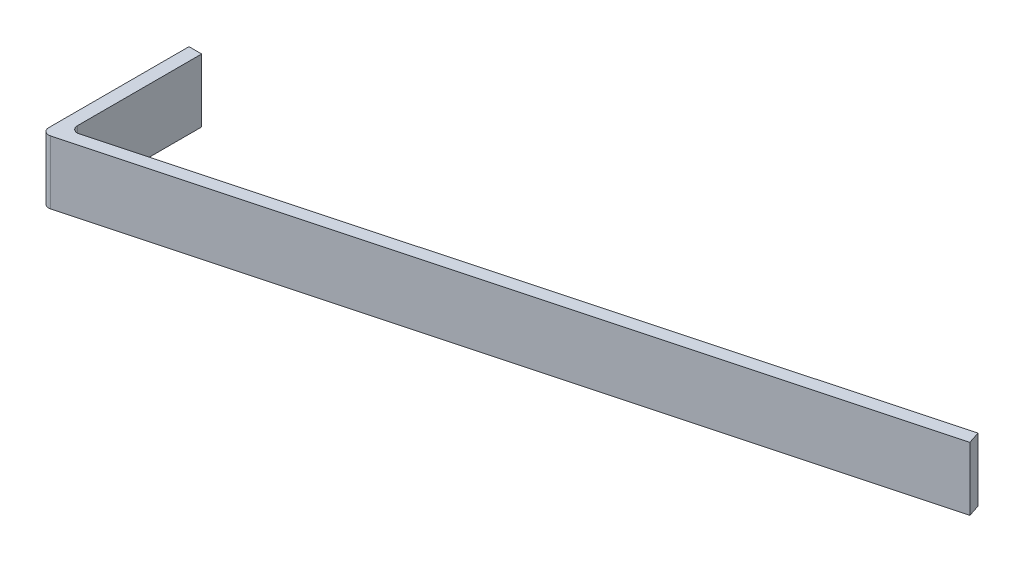
ISO-10303-21;
HEADER;
FILE_DESCRIPTION(('STEP AP214'),'2;1');
FILE_NAME('part.step','',(''),(''),'','','');
FILE_SCHEMA(('AUTOMOTIVE_DESIGN { 1 0 10303 214 1 1 1 1 }'));
ENDSEC;
DATA;
#1=APPLICATION_CONTEXT('core data for automotive mechanical design processes');
#2=APPLICATION_PROTOCOL_DEFINITION('international standard','automotive_design',2000,#1);
#3=PRODUCT_CONTEXT('',#1,'mechanical');
#4=PRODUCT('Part','Part','',(#3));
#5=PRODUCT_RELATED_PRODUCT_CATEGORY('part','',(#4));
#6=PRODUCT_DEFINITION_FORMATION('','',#4);
#7=PRODUCT_DEFINITION_CONTEXT('part definition',#1,'design');
#8=PRODUCT_DEFINITION('design','',#6,#7);
#9=PRODUCT_DEFINITION_SHAPE('','',#8);
#10=(LENGTH_UNIT() NAMED_UNIT(*) SI_UNIT(.MILLI.,.METRE.));
#11=(NAMED_UNIT(*) PLANE_ANGLE_UNIT() SI_UNIT($,.RADIAN.));
#12=(NAMED_UNIT(*) SI_UNIT($,.STERADIAN.) SOLID_ANGLE_UNIT());
#13=UNCERTAINTY_MEASURE_WITH_UNIT(LENGTH_MEASURE(1.E-05),#10,'distance_accuracy_value','');
#14=(GEOMETRIC_REPRESENTATION_CONTEXT(3) GLOBAL_UNCERTAINTY_ASSIGNED_CONTEXT((#13)) GLOBAL_UNIT_ASSIGNED_CONTEXT((#10,
#11,#12)) REPRESENTATION_CONTEXT('',''));
#15=CARTESIAN_POINT('',(0.,0.,0.));
#16=DIRECTION('',(0.,0.,1.));
#17=DIRECTION('',(1.,0.,0.));
#18=AXIS2_PLACEMENT_3D('',#15,#16,#17);
#19=CARTESIAN_POINT('',(0.,10.,0.));
#20=DIRECTION('',(1.,0.,0.));
#21=DIRECTION('',(0.,0.,-1.));
#22=AXIS2_PLACEMENT_3D('',#19,#20,#21);
#23=PLANE('',#22);
#24=DIRECTION('',(0.,0.,1.));
#25=VECTOR('',#24,1.);
#26=CARTESIAN_POINT('',(0.,0.,0.));
#27=LINE('',#26,#25);
#28=CARTESIAN_POINT('',(0.,0.,-23.5));
#29=VERTEX_POINT('',#28);
#30=CARTESIAN_POINT('',(0.,0.,-1.3032253728412));
#31=VERTEX_POINT('',#30);
#32=EDGE_CURVE('E123',#29,#31,#27,.T.);
#33=ORIENTED_EDGE('',*,*,#32,.T.);
#34=DIRECTION('',(0.,-1.,0.));
#35=VECTOR('',#34,1.);
#36=CARTESIAN_POINT('',(0.,10.,-1.3032253728412));
#37=LINE('',#36,#35);
#38=CARTESIAN_POINT('',(0.,10.,-1.3032253728412));
#39=VERTEX_POINT('',#38);
#40=EDGE_CURVE('E151',#31,#39,#37,.F.);
#41=ORIENTED_EDGE('',*,*,#40,.T.);
#42=DIRECTION('',(0.,0.,1.));
#43=VECTOR('',#42,1.);
#44=CARTESIAN_POINT('',(0.,10.,0.));
#45=LINE('',#44,#43);
#46=CARTESIAN_POINT('',(0.,10.,-23.5));
#47=VERTEX_POINT('',#46);
#48=EDGE_CURVE('E125',#47,#39,#45,.T.);
#49=ORIENTED_EDGE('',*,*,#48,.F.);
#50=DIRECTION('',(0.,-1.,0.));
#51=VECTOR('',#50,1.);
#52=CARTESIAN_POINT('',(0.,10.,-23.5));
#53=LINE('',#52,#51);
#54=EDGE_CURVE('E133',#47,#29,#53,.T.);
#55=ORIENTED_EDGE('',*,*,#54,.T.);
#56=EDGE_LOOP('',(#33,#41,#49,#55));
#57=FACE_BOUND('',#56,.T.);
#58=ADVANCED_FACE('F35',(#57),#23,.F.);
#59=CARTESIAN_POINT('',(0.,10.,0.));
#60=DIRECTION('',(-0.258819045102518,0.,-0.965925826289069));
#61=DIRECTION('',(-0.965925826289069,0.,0.258819045102518));
#62=AXIS2_PLACEMENT_3D('',#59,#60,#61);
#63=PLANE('',#62);
#64=DIRECTION('',(0.965925826289069,0.,-0.258819045102518));
#65=VECTOR('',#64,1.);
#66=CARTESIAN_POINT('',(0.,10.,0.));
#67=LINE('',#66,#65);
#68=CARTESIAN_POINT('',(1.25881904510252,10.,-0.337299546552133));
#69=VERTEX_POINT('',#68);
#70=CARTESIAN_POINT('',(115.911099154688,10.,-31.0582854123021));
#71=VERTEX_POINT('',#70);
#72=EDGE_CURVE('E116',#69,#71,#67,.T.);
#73=ORIENTED_EDGE('',*,*,#72,.F.);
#74=DIRECTION('',(0.,-1.,0.));
#75=VECTOR('',#74,1.);
#76=CARTESIAN_POINT('',(1.25881904510252,10.,-0.337299546552133));
#77=LINE('',#76,#75);
#78=CARTESIAN_POINT('',(1.25881904510252,0.,-0.337299546552133));
#79=VERTEX_POINT('',#78);
#80=EDGE_CURVE('E146',#69,#79,#77,.T.);
#81=ORIENTED_EDGE('',*,*,#80,.T.);
#82=DIRECTION('',(0.965925826289069,0.,-0.258819045102518));
#83=VECTOR('',#82,1.);
#84=CARTESIAN_POINT('',(0.,0.,0.));
#85=LINE('',#84,#83);
#86=CARTESIAN_POINT('',(115.911099154688,0.,-31.0582854123021));
#87=VERTEX_POINT('',#86);
#88=EDGE_CURVE('E136',#79,#87,#85,.T.);
#89=ORIENTED_EDGE('',*,*,#88,.T.);
#90=DIRECTION('',(0.,-1.,0.));
#91=VECTOR('',#90,1.);
#92=CARTESIAN_POINT('',(115.911099154688,10.,-31.0582854123021));
#93=LINE('',#92,#91);
#94=EDGE_CURVE('E111',#71,#87,#93,.T.);
#95=ORIENTED_EDGE('',*,*,#94,.F.);
#96=EDGE_LOOP('',(#73,#81,#89,#95));
#97=FACE_BOUND('',#96,.T.);
#98=ADVANCED_FACE('F181',(#97),#63,.F.);
#99=CARTESIAN_POINT('',(2.,10.,-0.535898384862239));
#100=DIRECTION('',(-1.,0.,0.));
#101=DIRECTION('',(0.,0.,1.));
#102=AXIS2_PLACEMENT_3D('',#99,#100,#101);
#103=PLANE('',#102);
#104=DIRECTION('',(0.,0.,-1.));
#105=VECTOR('',#104,1.);
#106=CARTESIAN_POINT('',(2.,10.,-0.535898384862239));
#107=LINE('',#106,#105);
#108=CARTESIAN_POINT('',(2.,10.,-3.84102587555032));
#109=VERTEX_POINT('',#108);
#110=CARTESIAN_POINT('',(2.,10.,-23.5));
#111=VERTEX_POINT('',#110);
#112=EDGE_CURVE('E129',#109,#111,#107,.T.);
#113=ORIENTED_EDGE('',*,*,#112,.F.);
#114=DIRECTION('',(0.,-1.,0.));
#115=VECTOR('',#114,1.);
#116=CARTESIAN_POINT('',(2.,10.,-3.84102587555032));
#117=LINE('',#116,#115);
#118=CARTESIAN_POINT('',(2.,0.,-3.84102587555032));
#119=VERTEX_POINT('',#118);
#120=EDGE_CURVE('E155',#109,#119,#117,.T.);
#121=ORIENTED_EDGE('',*,*,#120,.T.);
#122=DIRECTION('',(0.,0.,-1.));
#123=VECTOR('',#122,1.);
#124=CARTESIAN_POINT('',(2.,0.,-0.535898384862239));
#125=LINE('',#124,#123);
#126=CARTESIAN_POINT('',(2.,0.,-23.5));
#127=VERTEX_POINT('',#126);
#128=EDGE_CURVE('E138',#119,#127,#125,.T.);
#129=ORIENTED_EDGE('',*,*,#128,.T.);
#130=DIRECTION('',(0.,-1.,0.));
#131=VECTOR('',#130,1.);
#132=CARTESIAN_POINT('',(2.,10.,-23.5));
#133=LINE('',#132,#131);
#134=EDGE_CURVE('E143',#111,#127,#133,.T.);
#135=ORIENTED_EDGE('',*,*,#134,.F.);
#136=EDGE_LOOP('',(#113,#121,#129,#135));
#137=FACE_BOUND('',#136,.T.);
#138=ADVANCED_FACE('F166',(#137),#103,.F.);
#139=CARTESIAN_POINT('',(0.,10.,-23.5));
#140=DIRECTION('',(0.,0.,1.));
#141=DIRECTION('',(1.,0.,0.));
#142=AXIS2_PLACEMENT_3D('',#139,#140,#141);
#143=PLANE('',#142);
#144=DIRECTION('',(-1.,0.,0.));
#145=VECTOR('',#144,1.);
#146=CARTESIAN_POINT('',(0.,0.,-23.5));
#147=LINE('',#146,#145);
#148=EDGE_CURVE('E127',#127,#29,#147,.T.);
#149=ORIENTED_EDGE('',*,*,#148,.T.);
#150=ORIENTED_EDGE('',*,*,#54,.F.);
#151=DIRECTION('',(-1.,0.,0.));
#152=VECTOR('',#151,1.);
#153=CARTESIAN_POINT('',(0.,10.,-23.5));
#154=LINE('',#153,#152);
#155=EDGE_CURVE('E131',#111,#47,#154,.T.);
#156=ORIENTED_EDGE('',*,*,#155,.F.);
#157=ORIENTED_EDGE('',*,*,#134,.T.);
#158=EDGE_LOOP('',(#149,#150,#156,#157));
#159=FACE_BOUND('',#158,.T.);
#160=ADVANCED_FACE('F173',(#159),#143,.F.);
#161=CARTESIAN_POINT('',(0.,10.,0.));
#162=DIRECTION('',(0.,-1.,0.));
#163=DIRECTION('',(0.,0.,-1.));
#164=AXIS2_PLACEMENT_3D('',#161,#162,#163);
#165=PLANE('',#164);
#166=ORIENTED_EDGE('',*,*,#48,.T.);
#167=CARTESIAN_POINT('',(1.,10.,-1.3032253728412));
#168=DIRECTION('',(0.,-1.,0.));
#169=DIRECTION('',(0.,0.,-1.));
#170=AXIS2_PLACEMENT_3D('',#167,#168,#169);
#171=CIRCLE('',#170,1.);
#172=EDGE_CURVE('E153',#39,#69,#171,.F.);
#173=ORIENTED_EDGE('',*,*,#172,.T.);
#174=ORIENTED_EDGE('',*,*,#72,.T.);
#175=DIRECTION('',(0.312653943920722,0.,0.949867101941539));
#176=VECTOR('',#175,1.);
#177=CARTESIAN_POINT('',(115.285791266847,10.,-32.9580196161852));
#178=LINE('',#177,#176);
#179=CARTESIAN_POINT('',(115.285791266847,10.,-32.9580196161852));
#180=VERTEX_POINT('',#179);
#181=EDGE_CURVE('E103',#180,#71,#178,.T.);
#182=ORIENTED_EDGE('',*,*,#181,.F.);
#183=DIRECTION('',(0.965784766411818,0.,-0.259344915058826));
#184=VECTOR('',#183,1.);
#185=CARTESIAN_POINT('',(0.,10.,-2.));
#186=LINE('',#185,#184);
#187=CARTESIAN_POINT('',(3.25934491505883,10.,-2.8752411091385));
#188=VERTEX_POINT('',#187);
#189=EDGE_CURVE('E97',#188,#180,#186,.T.);
#190=ORIENTED_EDGE('',*,*,#189,.F.);
#191=CARTESIAN_POINT('',(3.,10.,-3.84102587555032));
#192=DIRECTION('',(0.,-1.,0.));
#193=DIRECTION('',(0.,0.,-1.));
#194=AXIS2_PLACEMENT_3D('',#191,#192,#193);
#195=CIRCLE('',#194,1.);
#196=EDGE_CURVE('E11',#188,#109,#195,.T.);
#197=ORIENTED_EDGE('',*,*,#196,.T.);
#198=ORIENTED_EDGE('',*,*,#112,.T.);
#199=ORIENTED_EDGE('',*,*,#155,.T.);
#200=EDGE_LOOP('',(#166,#173,#174,#182,#190,#197,#198,#199));
#201=FACE_BOUND('',#200,.T.);
#202=ADVANCED_FACE('F114',(#201),#165,.F.);
#203=CARTESIAN_POINT('',(0.,0.,0.));
#204=DIRECTION('',(0.,-1.,0.));
#205=DIRECTION('',(0.,0.,-1.));
#206=AXIS2_PLACEMENT_3D('',#203,#204,#205);
#207=PLANE('',#206);
#208=ORIENTED_EDGE('',*,*,#88,.F.);
#209=CARTESIAN_POINT('',(1.,0.,-1.3032253728412));
#210=DIRECTION('',(0.,-1.,0.));
#211=DIRECTION('',(0.,0.,-1.));
#212=AXIS2_PLACEMENT_3D('',#209,#210,#211);
#213=CIRCLE('',#212,1.);
#214=EDGE_CURVE('E149',#79,#31,#213,.T.);
#215=ORIENTED_EDGE('',*,*,#214,.T.);
#216=ORIENTED_EDGE('',*,*,#32,.F.);
#217=ORIENTED_EDGE('',*,*,#148,.F.);
#218=ORIENTED_EDGE('',*,*,#128,.F.);
#219=CARTESIAN_POINT('',(3.,0.,-3.84102587555032));
#220=DIRECTION('',(0.,-1.,0.));
#221=DIRECTION('',(0.,0.,-1.));
#222=AXIS2_PLACEMENT_3D('',#219,#220,#221);
#223=CIRCLE('',#222,1.);
#224=CARTESIAN_POINT('',(3.25934491505883,0.,-2.8752411091385));
#225=VERTEX_POINT('',#224);
#226=EDGE_CURVE('E43',#119,#225,#223,.F.);
#227=ORIENTED_EDGE('',*,*,#226,.T.);
#228=DIRECTION('',(0.965784766411818,0.,-0.259344915058826));
#229=VECTOR('',#228,1.);
#230=CARTESIAN_POINT('',(0.,0.,-2.));
#231=LINE('',#230,#229);
#232=CARTESIAN_POINT('',(115.285791266847,0.,-32.9580196161852));
#233=VERTEX_POINT('',#232);
#234=EDGE_CURVE('E120',#225,#233,#231,.T.);
#235=ORIENTED_EDGE('',*,*,#234,.T.);
#236=DIRECTION('',(0.312653943920722,0.,0.949867101941539));
#237=VECTOR('',#236,1.);
#238=CARTESIAN_POINT('',(115.285791266847,0.,-32.9580196161852));
#239=LINE('',#238,#237);
#240=EDGE_CURVE('E104',#233,#87,#239,.T.);
#241=ORIENTED_EDGE('',*,*,#240,.T.);
#242=EDGE_LOOP('',(#208,#215,#216,#217,#218,#227,#235,#241));
#243=FACE_BOUND('',#242,.T.);
#244=ADVANCED_FACE('F161',(#243),#207,.T.);
#245=CARTESIAN_POINT('',(0.,10.,-2.));
#246=DIRECTION('',(-0.259344915058826,0.,-0.965784766411818));
#247=DIRECTION('',(-0.965784766411818,0.,0.259344915058826));
#248=AXIS2_PLACEMENT_3D('',#245,#246,#247);
#249=PLANE('',#248);
#250=ORIENTED_EDGE('',*,*,#234,.F.);
#251=DIRECTION('',(0.,-1.,0.));
#252=VECTOR('',#251,1.);
#253=CARTESIAN_POINT('',(3.25934491505883,10.,-2.8752411091385));
#254=LINE('',#253,#252);
#255=EDGE_CURVE('E56',#225,#188,#254,.F.);
#256=ORIENTED_EDGE('',*,*,#255,.T.);
#257=ORIENTED_EDGE('',*,*,#189,.T.);
#258=DIRECTION('',(0.,-1.,0.));
#259=VECTOR('',#258,1.);
#260=CARTESIAN_POINT('',(115.285791266847,10.,-32.9580196161852));
#261=LINE('',#260,#259);
#262=EDGE_CURVE('E100',#180,#233,#261,.T.);
#263=ORIENTED_EDGE('',*,*,#262,.T.);
#264=EDGE_LOOP('',(#250,#256,#257,#263));
#265=FACE_BOUND('',#264,.T.);
#266=ADVANCED_FACE('F99',(#265),#249,.T.);
#267=CARTESIAN_POINT('',(115.285791266847,10.,-32.9580196161852));
#268=DIRECTION('',(0.949867101941539,0.,-0.312653943920722));
#269=DIRECTION('',(-0.312653943920722,0.,-0.949867101941539));
#270=AXIS2_PLACEMENT_3D('',#267,#268,#269);
#271=PLANE('',#270);
#272=ORIENTED_EDGE('',*,*,#240,.F.);
#273=ORIENTED_EDGE('',*,*,#262,.F.);
#274=ORIENTED_EDGE('',*,*,#181,.T.);
#275=ORIENTED_EDGE('',*,*,#94,.T.);
#276=EDGE_LOOP('',(#272,#273,#274,#275));
#277=FACE_BOUND('',#276,.T.);
#278=ADVANCED_FACE('F108',(#277),#271,.T.);
#279=CARTESIAN_POINT('',(1.,10.,-1.3032253728412));
#280=DIRECTION('',(0.,-1.,0.));
#281=DIRECTION('',(0.,0.,-1.));
#282=AXIS2_PLACEMENT_3D('',#279,#280,#281);
#283=CYLINDRICAL_SURFACE('',#282,1.);
#284=ORIENTED_EDGE('',*,*,#172,.F.);
#285=ORIENTED_EDGE('',*,*,#40,.F.);
#286=ORIENTED_EDGE('',*,*,#214,.F.);
#287=ORIENTED_EDGE('',*,*,#80,.F.);
#288=EDGE_LOOP('',(#284,#285,#286,#287));
#289=FACE_BOUND('',#288,.T.);
#290=ADVANCED_FACE('F178',(#289),#283,.T.);
#291=CARTESIAN_POINT('',(3.,10.,-3.84102587555032));
#292=DIRECTION('',(0.,-1.,0.));
#293=DIRECTION('',(0.,0.,-1.));
#294=AXIS2_PLACEMENT_3D('',#291,#292,#293);
#295=CYLINDRICAL_SURFACE('',#294,1.);
#296=ORIENTED_EDGE('',*,*,#196,.F.);
#297=ORIENTED_EDGE('',*,*,#255,.F.);
#298=ORIENTED_EDGE('',*,*,#226,.F.);
#299=ORIENTED_EDGE('',*,*,#120,.F.);
#300=EDGE_LOOP('',(#296,#297,#298,#299));
#301=FACE_BOUND('',#300,.T.);
#302=ADVANCED_FACE('F37',(#301),#295,.F.);
#303=CLOSED_SHELL('',(#58,#98,#138,#160,#202,#244,#266,#278,#290,#302));
#304=MANIFOLD_SOLID_BREP('B2',#303);
#305=ADVANCED_BREP_SHAPE_REPRESENTATION('',(#18,#304),#14);
#306=SHAPE_DEFINITION_REPRESENTATION(#9,#305);
ENDSEC;
END-ISO-10303-21;
